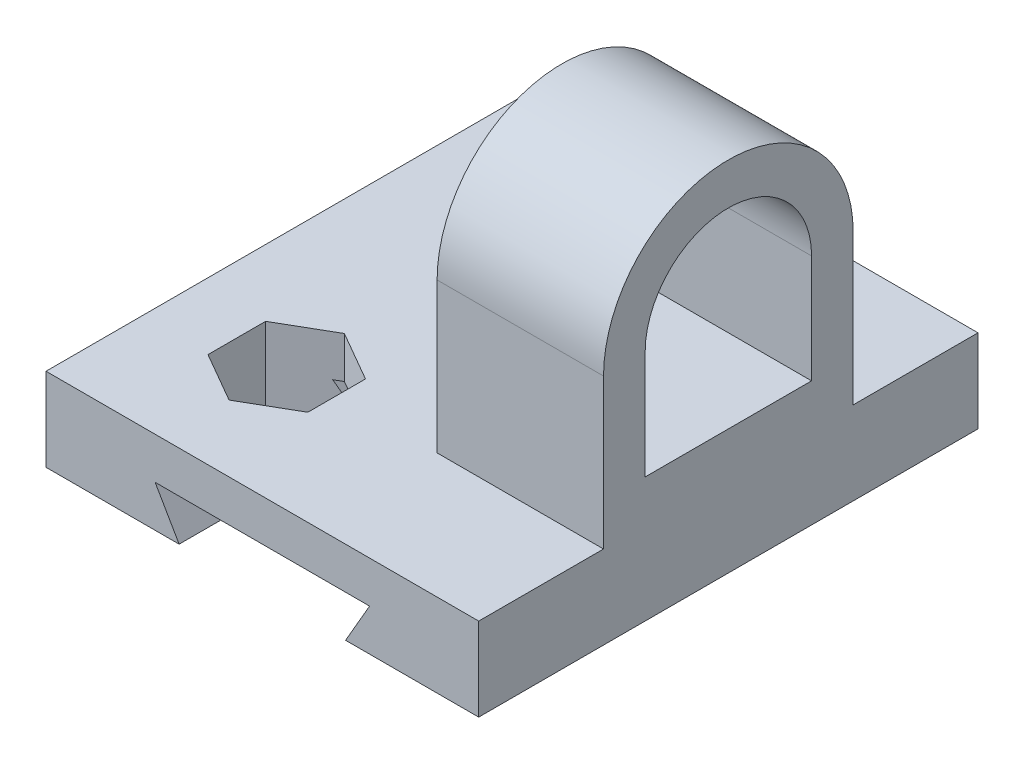
ISO-10303-21;
HEADER;
FILE_DESCRIPTION(('STEP AP214'),'2;1');
FILE_NAME('part.step','',(''),(''),'','','');
FILE_SCHEMA(('AUTOMOTIVE_DESIGN { 1 0 10303 214 1 1 1 1 }'));
ENDSEC;
DATA;
#1=APPLICATION_CONTEXT('core data for automotive mechanical design processes');
#2=APPLICATION_PROTOCOL_DEFINITION('international standard','automotive_design',2000,#1);
#3=PRODUCT_CONTEXT('',#1,'mechanical');
#4=PRODUCT('Part','Part','',(#3));
#5=PRODUCT_RELATED_PRODUCT_CATEGORY('part','',(#4));
#6=PRODUCT_DEFINITION_FORMATION('','',#4);
#7=PRODUCT_DEFINITION_CONTEXT('part definition',#1,'design');
#8=PRODUCT_DEFINITION('design','',#6,#7);
#9=PRODUCT_DEFINITION_SHAPE('','',#8);
#10=(LENGTH_UNIT() NAMED_UNIT(*) SI_UNIT(.MILLI.,.METRE.));
#11=(NAMED_UNIT(*) PLANE_ANGLE_UNIT() SI_UNIT($,.RADIAN.));
#12=(NAMED_UNIT(*) SI_UNIT($,.STERADIAN.) SOLID_ANGLE_UNIT());
#13=UNCERTAINTY_MEASURE_WITH_UNIT(LENGTH_MEASURE(1.E-05),#10,'distance_accuracy_value','');
#14=(GEOMETRIC_REPRESENTATION_CONTEXT(3) GLOBAL_UNCERTAINTY_ASSIGNED_CONTEXT((#13)) GLOBAL_UNIT_ASSIGNED_CONTEXT((#10,
#11,#12)) REPRESENTATION_CONTEXT('',''));
#15=CARTESIAN_POINT('',(0.,0.,0.));
#16=DIRECTION('',(0.,0.,1.));
#17=DIRECTION('',(1.,0.,0.));
#18=AXIS2_PLACEMENT_3D('',#15,#16,#17);
#19=CARTESIAN_POINT('',(-12.8867513459481,0.,30.));
#20=DIRECTION('',(-0.866025403784438,-0.500000000000001,0.));
#21=DIRECTION('',(0.500000000000001,-0.866025403784438,0.));
#22=AXIS2_PLACEMENT_3D('',#19,#20,#21);
#23=PLANE('',#22);
#24=DIRECTION('',(0.,0.,-1.));
#25=VECTOR('',#24,1.);
#26=CARTESIAN_POINT('',(-9.99999999999999,-5.,30.));
#27=LINE('',#26,#25);
#28=CARTESIAN_POINT('',(-9.99999999999999,-5.,30.));
#29=VERTEX_POINT('',#28);
#30=CARTESIAN_POINT('',(-9.99999999999999,-5.,20.8452994616207));
#31=VERTEX_POINT('',#30);
#32=EDGE_CURVE('E67',#29,#31,#27,.T.);
#33=ORIENTED_EDGE('',*,*,#32,.T.);
#34=DIRECTION('',(0.480384461415262,-0.832050294337843,-0.277350098112615));
#35=VECTOR('',#34,1.);
#36=CARTESIAN_POINT('',(-10.6149849113521,-3.93481488764993,21.2003611657374));
#37=LINE('',#36,#35);
#38=CARTESIAN_POINT('',(-12.,-1.53589838486227,22.));
#39=VERTEX_POINT('',#38);
#40=EDGE_CURVE('E265',#39,#31,#37,.T.);
#41=ORIENTED_EDGE('',*,*,#40,.F.);
#42=DIRECTION('',(0.480384461415262,-0.832050294337843,0.277350098112615));
#43=VECTOR('',#42,1.);
#44=CARTESIAN_POINT('',(-12.4611387575059,-0.737182627522773,21.7337614142202));
#45=LINE('',#44,#43);
#46=CARTESIAN_POINT('',(-12.8867513459481,0.,21.4880338717126));
#47=VERTEX_POINT('',#46);
#48=EDGE_CURVE('E262',#47,#39,#45,.T.);
#49=ORIENTED_EDGE('',*,*,#48,.F.);
#50=DIRECTION('',(0.,0.,-1.));
#51=VECTOR('',#50,1.);
#52=CARTESIAN_POINT('',(-12.8867513459481,0.,30.));
#53=LINE('',#52,#51);
#54=CARTESIAN_POINT('',(-12.8867513459481,0.,30.));
#55=VERTEX_POINT('',#54);
#56=EDGE_CURVE('E419',#55,#47,#53,.T.);
#57=ORIENTED_EDGE('',*,*,#56,.F.);
#58=DIRECTION('',(-0.500000000000001,0.866025403784438,0.));
#59=VECTOR('',#58,1.);
#60=CARTESIAN_POINT('',(-12.8867513459481,0.,30.));
#61=LINE('',#60,#59);
#62=EDGE_CURVE('E372',#29,#55,#61,.T.);
#63=ORIENTED_EDGE('',*,*,#62,.F.);
#64=EDGE_LOOP('',(#33,#41,#49,#57,#63));
#65=FACE_BOUND('',#64,.T.);
#66=ADVANCED_FACE('F59',(#65),#23,.F.);
#67=CARTESIAN_POINT('',(-26.,5.,30.));
#68=DIRECTION('',(0.,-1.,0.));
#69=DIRECTION('',(1.,0.,0.));
#70=AXIS2_PLACEMENT_3D('',#67,#68,#69);
#71=PLANE('',#70);
#72=DIRECTION('',(-0.866025403784438,0.,-0.5));
#73=VECTOR('',#72,1.);
#74=CARTESIAN_POINT('',(-5.99999999999999,5.,11.6076951545867));
#75=LINE('',#74,#73);
#76=CARTESIAN_POINT('',(-5.99999999999999,5.,11.6076951545867));
#77=VERTEX_POINT('',#76);
#78=CARTESIAN_POINT('',(-12.,5.,8.14359353944899));
#79=VERTEX_POINT('',#78);
#80=EDGE_CURVE('E280',#77,#79,#75,.T.);
#81=ORIENTED_EDGE('',*,*,#80,.F.);
#82=DIRECTION('',(0.,0.,-1.));
#83=VECTOR('',#82,1.);
#84=CARTESIAN_POINT('',(-5.99999999999999,5.,18.5358983848622));
#85=LINE('',#84,#83);
#86=CARTESIAN_POINT('',(-5.99999999999999,5.,18.5358983848622));
#87=VERTEX_POINT('',#86);
#88=EDGE_CURVE('E74',#87,#77,#85,.T.);
#89=ORIENTED_EDGE('',*,*,#88,.F.);
#90=DIRECTION('',(0.866025403784438,0.,-0.5));
#91=VECTOR('',#90,1.);
#92=CARTESIAN_POINT('',(-12.,5.,22.));
#93=LINE('',#92,#91);
#94=CARTESIAN_POINT('',(-12.,5.,22.));
#95=VERTEX_POINT('',#94);
#96=EDGE_CURVE('E240',#95,#87,#93,.T.);
#97=ORIENTED_EDGE('',*,*,#96,.F.);
#98=DIRECTION('',(0.866025403784438,0.,0.5));
#99=VECTOR('',#98,1.);
#100=CARTESIAN_POINT('',(-18.,5.,18.5358983848622));
#101=LINE('',#100,#99);
#102=CARTESIAN_POINT('',(-18.,5.,18.5358983848622));
#103=VERTEX_POINT('',#102);
#104=EDGE_CURVE('E288',#103,#95,#101,.T.);
#105=ORIENTED_EDGE('',*,*,#104,.F.);
#106=DIRECTION('',(0.,0.,1.));
#107=VECTOR('',#106,1.);
#108=CARTESIAN_POINT('',(-18.,5.,11.6076951545867));
#109=LINE('',#108,#107);
#110=CARTESIAN_POINT('',(-18.,5.,11.6076951545867));
#111=VERTEX_POINT('',#110);
#112=EDGE_CURVE('E285',#111,#103,#109,.T.);
#113=ORIENTED_EDGE('',*,*,#112,.F.);
#114=DIRECTION('',(-0.866025403784438,0.,0.5));
#115=VECTOR('',#114,1.);
#116=CARTESIAN_POINT('',(-12.,5.,8.14359353944899));
#117=LINE('',#116,#115);
#118=EDGE_CURVE('E282',#79,#111,#117,.T.);
#119=ORIENTED_EDGE('',*,*,#118,.F.);
#120=EDGE_LOOP('',(#81,#89,#97,#105,#113,#119));
#121=FACE_BOUND('',#120,.T.);
#122=DIRECTION('',(1.,0.,0.));
#123=VECTOR('',#122,1.);
#124=CARTESIAN_POINT('',(6.,4.99999999999998,15.));
#125=LINE('',#124,#123);
#126=CARTESIAN_POINT('',(6.,4.99999999999998,15.));
#127=VERTEX_POINT('',#126);
#128=CARTESIAN_POINT('',(26.,5.,15.));
#129=VERTEX_POINT('',#128);
#130=EDGE_CURVE('E357',#127,#129,#125,.T.);
#131=ORIENTED_EDGE('',*,*,#130,.F.);
#132=DIRECTION('',(0.,0.,1.));
#133=VECTOR('',#132,1.);
#134=CARTESIAN_POINT('',(6.,4.99999999999998,0.));
#135=LINE('',#134,#133);
#136=CARTESIAN_POINT('',(6.,4.99999999999998,-15.));
#137=VERTEX_POINT('',#136);
#138=EDGE_CURVE('E345',#137,#127,#135,.T.);
#139=ORIENTED_EDGE('',*,*,#138,.F.);
#140=DIRECTION('',(1.,0.,0.));
#141=VECTOR('',#140,1.);
#142=CARTESIAN_POINT('',(6.,4.99999999999998,-15.));
#143=LINE('',#142,#141);
#144=CARTESIAN_POINT('',(26.,5.,-15.));
#145=VERTEX_POINT('',#144);
#146=EDGE_CURVE('E359',#137,#145,#143,.T.);
#147=ORIENTED_EDGE('',*,*,#146,.T.);
#148=DIRECTION('',(0.,0.,-1.));
#149=VECTOR('',#148,1.);
#150=CARTESIAN_POINT('',(26.,5.,30.));
#151=LINE('',#150,#149);
#152=CARTESIAN_POINT('',(26.,5.,-30.));
#153=VERTEX_POINT('',#152);
#154=EDGE_CURVE('E405',#145,#153,#151,.T.);
#155=ORIENTED_EDGE('',*,*,#154,.T.);
#156=DIRECTION('',(-1.,0.,0.));
#157=VECTOR('',#156,1.);
#158=CARTESIAN_POINT('',(-26.,5.,-30.));
#159=LINE('',#158,#157);
#160=CARTESIAN_POINT('',(-26.,5.,-30.));
#161=VERTEX_POINT('',#160);
#162=EDGE_CURVE('E370',#153,#161,#159,.T.);
#163=ORIENTED_EDGE('',*,*,#162,.T.);
#164=DIRECTION('',(0.,0.,-1.));
#165=VECTOR('',#164,1.);
#166=CARTESIAN_POINT('',(-26.,5.,30.));
#167=LINE('',#166,#165);
#168=CARTESIAN_POINT('',(-26.,5.,30.));
#169=VERTEX_POINT('',#168);
#170=EDGE_CURVE('E384',#169,#161,#167,.T.);
#171=ORIENTED_EDGE('',*,*,#170,.F.);
#172=DIRECTION('',(-1.,0.,0.));
#173=VECTOR('',#172,1.);
#174=CARTESIAN_POINT('',(-26.,5.,30.));
#175=LINE('',#174,#173);
#176=CARTESIAN_POINT('',(26.,5.,30.));
#177=VERTEX_POINT('',#176);
#178=EDGE_CURVE('E382',#177,#169,#175,.T.);
#179=ORIENTED_EDGE('',*,*,#178,.F.);
#180=EDGE_CURVE('E406',#177,#129,#151,.T.);
#181=ORIENTED_EDGE('',*,*,#180,.T.);
#182=EDGE_LOOP('',(#131,#139,#147,#155,#163,#171,#179,#181));
#183=FACE_BOUND('',#182,.T.);
#184=ADVANCED_FACE('F463',(#121,#183),#71,.F.);
#185=CARTESIAN_POINT('',(-26.,-5.00000000000001,30.));
#186=DIRECTION('',(1.,0.,0.));
#187=DIRECTION('',(0.,0.,-1.));
#188=AXIS2_PLACEMENT_3D('',#185,#186,#187);
#189=PLANE('',#188);
#190=DIRECTION('',(0.,-1.,0.));
#191=VECTOR('',#190,1.);
#192=CARTESIAN_POINT('',(-26.,-5.00000000000001,-30.));
#193=LINE('',#192,#191);
#194=CARTESIAN_POINT('',(-26.,-5.00000000000001,-30.));
#195=VERTEX_POINT('',#194);
#196=EDGE_CURVE('E365',#161,#195,#193,.T.);
#197=ORIENTED_EDGE('',*,*,#196,.T.);
#198=DIRECTION('',(0.,0.,-1.));
#199=VECTOR('',#198,1.);
#200=CARTESIAN_POINT('',(-26.,-5.00000000000001,30.));
#201=LINE('',#200,#199);
#202=CARTESIAN_POINT('',(-26.,-5.00000000000001,30.));
#203=VERTEX_POINT('',#202);
#204=EDGE_CURVE('E12',#203,#195,#201,.T.);
#205=ORIENTED_EDGE('',*,*,#204,.F.);
#206=DIRECTION('',(0.,-1.,0.));
#207=VECTOR('',#206,1.);
#208=CARTESIAN_POINT('',(-26.,-5.00000000000001,30.));
#209=LINE('',#208,#207);
#210=EDGE_CURVE('E366',#169,#203,#209,.T.);
#211=ORIENTED_EDGE('',*,*,#210,.F.);
#212=ORIENTED_EDGE('',*,*,#170,.T.);
#213=EDGE_LOOP('',(#197,#205,#211,#212));
#214=FACE_BOUND('',#213,.T.);
#215=ADVANCED_FACE('F61',(#214),#189,.F.);
#216=CARTESIAN_POINT('',(-9.99999999999999,-5.,30.));
#217=DIRECTION('',(0.,1.,0.));
#218=DIRECTION('',(-1.,0.,0.));
#219=AXIS2_PLACEMENT_3D('',#216,#217,#218);
#220=PLANE('',#219);
#221=DIRECTION('',(-0.866025403784439,0.,-0.5));
#222=VECTOR('',#221,1.);
#223=CARTESIAN_POINT('',(-18.,-5.00000000000001,18.5358983848622));
#224=LINE('',#223,#222);
#225=CARTESIAN_POINT('',(-12.,-5.00000000000001,22.));
#226=VERTEX_POINT('',#225);
#227=CARTESIAN_POINT('',(-18.,-5.00000000000001,18.5358983848622));
#228=VERTEX_POINT('',#227);
#229=EDGE_CURVE('E273',#226,#228,#224,.T.);
#230=ORIENTED_EDGE('',*,*,#229,.F.);
#231=DIRECTION('',(-0.866025403784439,0.,0.5));
#232=VECTOR('',#231,1.);
#233=CARTESIAN_POINT('',(-12.,-5.,22.));
#234=LINE('',#233,#232);
#235=EDGE_CURVE('E276',#31,#226,#234,.T.);
#236=ORIENTED_EDGE('',*,*,#235,.F.);
#237=ORIENTED_EDGE('',*,*,#32,.F.);
#238=DIRECTION('',(1.,0.,0.));
#239=VECTOR('',#238,1.);
#240=CARTESIAN_POINT('',(-9.99999999999999,-5.,30.));
#241=LINE('',#240,#239);
#242=EDGE_CURVE('E369',#203,#29,#241,.T.);
#243=ORIENTED_EDGE('',*,*,#242,.F.);
#244=ORIENTED_EDGE('',*,*,#204,.T.);
#245=DIRECTION('',(1.,0.,0.));
#246=VECTOR('',#245,1.);
#247=CARTESIAN_POINT('',(-9.99999999999999,-5.,-30.));
#248=LINE('',#247,#246);
#249=CARTESIAN_POINT('',(-9.99999999999999,-5.,-30.));
#250=VERTEX_POINT('',#249);
#251=EDGE_CURVE('E387',#195,#250,#248,.T.);
#252=ORIENTED_EDGE('',*,*,#251,.T.);
#253=CARTESIAN_POINT('',(-9.99999999999999,-5.,9.29829407782823));
#254=VERTEX_POINT('',#253);
#255=EDGE_CURVE('E420',#254,#250,#27,.T.);
#256=ORIENTED_EDGE('',*,*,#255,.F.);
#257=DIRECTION('',(0.866025403784439,0.,0.5));
#258=VECTOR('',#257,1.);
#259=CARTESIAN_POINT('',(-5.99999999999999,-5.,11.6076951545867));
#260=LINE('',#259,#258);
#261=CARTESIAN_POINT('',(-12.,-5.,8.14359353944899));
#262=VERTEX_POINT('',#261);
#263=EDGE_CURVE('E305',#262,#254,#260,.T.);
#264=ORIENTED_EDGE('',*,*,#263,.F.);
#265=DIRECTION('',(0.866025403784439,0.,-0.5));
#266=VECTOR('',#265,1.);
#267=CARTESIAN_POINT('',(-12.,-5.,8.14359353944899));
#268=LINE('',#267,#266);
#269=CARTESIAN_POINT('',(-18.,-5.,11.6076951545867));
#270=VERTEX_POINT('',#269);
#271=EDGE_CURVE('E267',#270,#262,#268,.T.);
#272=ORIENTED_EDGE('',*,*,#271,.F.);
#273=DIRECTION('',(0.,0.,-1.));
#274=VECTOR('',#273,1.);
#275=CARTESIAN_POINT('',(-18.,-5.00000000000001,11.6076951545867));
#276=LINE('',#275,#274);
#277=EDGE_CURVE('E270',#228,#270,#276,.T.);
#278=ORIENTED_EDGE('',*,*,#277,.F.);
#279=EDGE_LOOP('',(#230,#236,#237,#243,#244,#252,#256,#264,#272,#278));
#280=FACE_BOUND('',#279,.T.);
#281=ADVANCED_FACE('F437',(#280),#220,.F.);
#282=CARTESIAN_POINT('',(-12.8867513459481,0.,8.65555966773641));
#283=VERTEX_POINT('',#282);
#284=CARTESIAN_POINT('',(-12.8867513459481,0.,-30.));
#285=VERTEX_POINT('',#284);
#286=EDGE_CURVE('E418',#283,#285,#53,.T.);
#287=ORIENTED_EDGE('',*,*,#286,.F.);
#288=DIRECTION('',(-0.480384461415262,0.832050294337843,0.277350098112615));
#289=VECTOR('',#288,1.);
#290=CARTESIAN_POINT('',(-10.6149849113521,-3.93481488764993,7.34395470518643));
#291=LINE('',#290,#289);
#292=CARTESIAN_POINT('',(-12.,-1.53589838486227,8.14359353944899));
#293=VERTEX_POINT('',#292);
#294=EDGE_CURVE('E260',#293,#283,#291,.T.);
#295=ORIENTED_EDGE('',*,*,#294,.F.);
#296=DIRECTION('',(-0.480384461415262,0.832050294337843,-0.277350098112615));
#297=VECTOR('',#296,1.);
#298=CARTESIAN_POINT('',(-8.76883106519824,-7.13244714777709,10.0091097937539));
#299=LINE('',#298,#297);
#300=EDGE_CURVE('E246',#254,#293,#299,.T.);
#301=ORIENTED_EDGE('',*,*,#300,.F.);
#302=ORIENTED_EDGE('',*,*,#255,.T.);
#303=DIRECTION('',(-0.500000000000001,0.866025403784438,0.));
#304=VECTOR('',#303,1.);
#305=CARTESIAN_POINT('',(-12.8867513459481,0.,-30.));
#306=LINE('',#305,#304);
#307=EDGE_CURVE('E390',#250,#285,#306,.T.);
#308=ORIENTED_EDGE('',*,*,#307,.T.);
#309=EDGE_LOOP('',(#287,#295,#301,#302,#308));
#310=FACE_BOUND('',#309,.T.);
#311=ADVANCED_FACE('F430',(#310),#23,.F.);
#312=CARTESIAN_POINT('',(12.8867513459482,0.,30.));
#313=DIRECTION('',(0.,1.,0.));
#314=DIRECTION('',(-1.,0.,0.));
#315=AXIS2_PLACEMENT_3D('',#312,#313,#314);
#316=PLANE('',#315);
#317=ORIENTED_EDGE('',*,*,#56,.T.);
#318=DIRECTION('',(-0.866025403784439,0.,-0.5));
#319=VECTOR('',#318,1.);
#320=CARTESIAN_POINT('',(-18.,0.,18.5358983848622));
#321=LINE('',#320,#319);
#322=CARTESIAN_POINT('',(-12.,0.,22.));
#323=VERTEX_POINT('',#322);
#324=EDGE_CURVE('E255',#323,#47,#321,.T.);
#325=ORIENTED_EDGE('',*,*,#324,.F.);
#326=DIRECTION('',(-0.866025403784439,0.,0.5));
#327=VECTOR('',#326,1.);
#328=CARTESIAN_POINT('',(-12.,0.,22.));
#329=LINE('',#328,#327);
#330=CARTESIAN_POINT('',(-5.99999999999999,0.,18.5358983848622));
#331=VERTEX_POINT('',#330);
#332=EDGE_CURVE('E253',#331,#323,#329,.T.);
#333=ORIENTED_EDGE('',*,*,#332,.F.);
#334=DIRECTION('',(0.,0.,1.));
#335=VECTOR('',#334,1.);
#336=CARTESIAN_POINT('',(-5.99999999999999,0.,18.5358983848622));
#337=LINE('',#336,#335);
#338=CARTESIAN_POINT('',(-5.99999999999999,0.,11.6076951545867));
#339=VERTEX_POINT('',#338);
#340=EDGE_CURVE('E234',#339,#331,#337,.T.);
#341=ORIENTED_EDGE('',*,*,#340,.F.);
#342=DIRECTION('',(0.866025403784439,0.,0.5));
#343=VECTOR('',#342,1.);
#344=CARTESIAN_POINT('',(-5.99999999999999,0.,11.6076951545867));
#345=LINE('',#344,#343);
#346=CARTESIAN_POINT('',(-12.,0.,8.14359353944899));
#347=VERTEX_POINT('',#346);
#348=EDGE_CURVE('E243',#347,#339,#345,.T.);
#349=ORIENTED_EDGE('',*,*,#348,.F.);
#350=DIRECTION('',(0.866025403784439,0.,-0.5));
#351=VECTOR('',#350,1.);
#352=CARTESIAN_POINT('',(-12.,0.,8.14359353944899));
#353=LINE('',#352,#351);
#354=EDGE_CURVE('E82',#283,#347,#353,.T.);
#355=ORIENTED_EDGE('',*,*,#354,.F.);
#356=ORIENTED_EDGE('',*,*,#286,.T.);
#357=DIRECTION('',(1.,0.,0.));
#358=VECTOR('',#357,1.);
#359=CARTESIAN_POINT('',(12.8867513459482,0.,-30.));
#360=LINE('',#359,#358);
#361=CARTESIAN_POINT('',(12.8867513459482,0.,-30.));
#362=VERTEX_POINT('',#361);
#363=EDGE_CURVE('E393',#285,#362,#360,.T.);
#364=ORIENTED_EDGE('',*,*,#363,.T.);
#365=DIRECTION('',(0.,0.,-1.));
#366=VECTOR('',#365,1.);
#367=CARTESIAN_POINT('',(12.8867513459482,0.,30.));
#368=LINE('',#367,#366);
#369=CARTESIAN_POINT('',(12.8867513459482,0.,30.));
#370=VERTEX_POINT('',#369);
#371=EDGE_CURVE('E415',#370,#362,#368,.T.);
#372=ORIENTED_EDGE('',*,*,#371,.F.);
#373=DIRECTION('',(1.,0.,0.));
#374=VECTOR('',#373,1.);
#375=CARTESIAN_POINT('',(12.8867513459482,0.,30.));
#376=LINE('',#375,#374);
#377=EDGE_CURVE('E374',#55,#370,#376,.T.);
#378=ORIENTED_EDGE('',*,*,#377,.F.);
#379=EDGE_LOOP('',(#317,#325,#333,#341,#349,#355,#356,#364,#372,#378));
#380=FACE_BOUND('',#379,.T.);
#381=ADVANCED_FACE('F250',(#380),#316,.F.);
#382=CARTESIAN_POINT('',(10.,-5.,30.));
#383=DIRECTION('',(0.866025403784436,-0.500000000000005,0.));
#384=DIRECTION('',(0.500000000000005,0.866025403784436,0.));
#385=AXIS2_PLACEMENT_3D('',#382,#383,#384);
#386=PLANE('',#385);
#387=DIRECTION('',(-0.500000000000005,-0.866025403784436,0.));
#388=VECTOR('',#387,1.);
#389=CARTESIAN_POINT('',(10.,-5.,-30.));
#390=LINE('',#389,#388);
#391=CARTESIAN_POINT('',(10.,-5.,-30.));
#392=VERTEX_POINT('',#391);
#393=EDGE_CURVE('E395',#362,#392,#390,.T.);
#394=ORIENTED_EDGE('',*,*,#393,.T.);
#395=DIRECTION('',(0.,0.,-1.));
#396=VECTOR('',#395,1.);
#397=CARTESIAN_POINT('',(10.,-5.,30.));
#398=LINE('',#397,#396);
#399=CARTESIAN_POINT('',(10.,-5.,30.));
#400=VERTEX_POINT('',#399);
#401=EDGE_CURVE('E412',#400,#392,#398,.T.);
#402=ORIENTED_EDGE('',*,*,#401,.F.);
#403=DIRECTION('',(-0.500000000000005,-0.866025403784436,0.));
#404=VECTOR('',#403,1.);
#405=CARTESIAN_POINT('',(10.,-5.,30.));
#406=LINE('',#405,#404);
#407=EDGE_CURVE('E376',#370,#400,#406,.T.);
#408=ORIENTED_EDGE('',*,*,#407,.F.);
#409=ORIENTED_EDGE('',*,*,#371,.T.);
#410=EDGE_LOOP('',(#394,#402,#408,#409));
#411=FACE_BOUND('',#410,.T.);
#412=ADVANCED_FACE('F448',(#411),#386,.F.);
#413=CARTESIAN_POINT('',(26.,-5.,30.));
#414=DIRECTION('',(0.,1.,0.));
#415=DIRECTION('',(-1.,0.,0.));
#416=AXIS2_PLACEMENT_3D('',#413,#414,#415);
#417=PLANE('',#416);
#418=DIRECTION('',(1.,0.,0.));
#419=VECTOR('',#418,1.);
#420=CARTESIAN_POINT('',(26.,-5.,-30.));
#421=LINE('',#420,#419);
#422=CARTESIAN_POINT('',(26.,-5.,-30.));
#423=VERTEX_POINT('',#422);
#424=EDGE_CURVE('E397',#392,#423,#421,.T.);
#425=ORIENTED_EDGE('',*,*,#424,.T.);
#426=DIRECTION('',(0.,0.,-1.));
#427=VECTOR('',#426,1.);
#428=CARTESIAN_POINT('',(26.,-5.,30.));
#429=LINE('',#428,#427);
#430=CARTESIAN_POINT('',(26.,-5.,30.));
#431=VERTEX_POINT('',#430);
#432=EDGE_CURVE('E409',#431,#423,#429,.T.);
#433=ORIENTED_EDGE('',*,*,#432,.F.);
#434=DIRECTION('',(1.,0.,0.));
#435=VECTOR('',#434,1.);
#436=CARTESIAN_POINT('',(26.,-5.,30.));
#437=LINE('',#436,#435);
#438=EDGE_CURVE('E378',#400,#431,#437,.T.);
#439=ORIENTED_EDGE('',*,*,#438,.F.);
#440=ORIENTED_EDGE('',*,*,#401,.T.);
#441=EDGE_LOOP('',(#425,#433,#439,#440));
#442=FACE_BOUND('',#441,.T.);
#443=ADVANCED_FACE('F517',(#442),#417,.F.);
#444=CARTESIAN_POINT('',(26.,5.,30.));
#445=DIRECTION('',(-1.,0.,0.));
#446=DIRECTION('',(0.,-1.,0.));
#447=AXIS2_PLACEMENT_3D('',#444,#445,#446);
#448=PLANE('',#447);
#449=DIRECTION('',(0.,1.,0.));
#450=VECTOR('',#449,1.);
#451=CARTESIAN_POINT('',(26.,5.,-30.));
#452=LINE('',#451,#450);
#453=EDGE_CURVE('E399',#423,#153,#452,.T.);
#454=ORIENTED_EDGE('',*,*,#453,.T.);
#455=ORIENTED_EDGE('',*,*,#154,.F.);
#456=DIRECTION('',(0.,-1.,0.));
#457=VECTOR('',#456,1.);
#458=CARTESIAN_POINT('',(26.,0.,-15.));
#459=LINE('',#458,#457);
#460=CARTESIAN_POINT('',(26.,23.,-15.));
#461=VERTEX_POINT('',#460);
#462=EDGE_CURVE('E352',#461,#145,#459,.T.);
#463=ORIENTED_EDGE('',*,*,#462,.F.);
#464=CARTESIAN_POINT('',(26.,23.,0.));
#465=DIRECTION('',(1.,0.,0.));
#466=DIRECTION('',(0.,1.,0.));
#467=AXIS2_PLACEMENT_3D('',#464,#465,#466);
#468=CIRCLE('',#467,15.);
#469=CARTESIAN_POINT('',(26.,23.,15.));
#470=VERTEX_POINT('',#469);
#471=EDGE_CURVE('E338',#470,#461,#468,.F.);
#472=ORIENTED_EDGE('',*,*,#471,.F.);
#473=DIRECTION('',(0.,1.,0.));
#474=VECTOR('',#473,1.);
#475=CARTESIAN_POINT('',(26.,0.,15.));
#476=LINE('',#475,#474);
#477=EDGE_CURVE('E343',#129,#470,#476,.T.);
#478=ORIENTED_EDGE('',*,*,#477,.F.);
#479=ORIENTED_EDGE('',*,*,#180,.F.);
#480=DIRECTION('',(0.,1.,0.));
#481=VECTOR('',#480,1.);
#482=CARTESIAN_POINT('',(26.,5.,30.));
#483=LINE('',#482,#481);
#484=EDGE_CURVE('E380',#431,#177,#483,.T.);
#485=ORIENTED_EDGE('',*,*,#484,.F.);
#486=ORIENTED_EDGE('',*,*,#432,.T.);
#487=EDGE_LOOP('',(#454,#455,#463,#472,#478,#479,#485,#486));
#488=FACE_BOUND('',#487,.T.);
#489=DIRECTION('',(0.,1.,0.));
#490=VECTOR('',#489,1.);
#491=CARTESIAN_POINT('',(26.,0.,10.));
#492=LINE('',#491,#490);
#493=CARTESIAN_POINT('',(26.,10.,10.));
#494=VERTEX_POINT('',#493);
#495=CARTESIAN_POINT('',(26.,23.,10.));
#496=VERTEX_POINT('',#495);
#497=EDGE_CURVE('E311',#494,#496,#492,.T.);
#498=ORIENTED_EDGE('',*,*,#497,.T.);
#499=CARTESIAN_POINT('',(26.,23.,0.));
#500=DIRECTION('',(1.,0.,0.));
#501=DIRECTION('',(0.,-1.,0.));
#502=AXIS2_PLACEMENT_3D('',#499,#500,#501);
#503=CIRCLE('',#502,10.);
#504=CARTESIAN_POINT('',(26.,23.,-10.));
#505=VERTEX_POINT('',#504);
#506=EDGE_CURVE('E307',#496,#505,#503,.F.);
#507=ORIENTED_EDGE('',*,*,#506,.T.);
#508=DIRECTION('',(0.,-1.,0.));
#509=VECTOR('',#508,1.);
#510=CARTESIAN_POINT('',(26.,0.,-10.));
#511=LINE('',#510,#509);
#512=CARTESIAN_POINT('',(26.,10.,-10.));
#513=VERTEX_POINT('',#512);
#514=EDGE_CURVE('E321',#505,#513,#511,.T.);
#515=ORIENTED_EDGE('',*,*,#514,.T.);
#516=DIRECTION('',(0.,0.,1.));
#517=VECTOR('',#516,1.);
#518=CARTESIAN_POINT('',(26.,10.,0.));
#519=LINE('',#518,#517);
#520=EDGE_CURVE('E324',#513,#494,#519,.T.);
#521=ORIENTED_EDGE('',*,*,#520,.T.);
#522=EDGE_LOOP('',(#498,#507,#515,#521));
#523=FACE_BOUND('',#522,.T.);
#524=ADVANCED_FACE('F512',(#488,#523),#448,.F.);
#525=CARTESIAN_POINT('',(0.,0.,30.));
#526=DIRECTION('',(0.,0.,-1.));
#527=DIRECTION('',(-1.,0.,0.));
#528=AXIS2_PLACEMENT_3D('',#525,#526,#527);
#529=PLANE('',#528);
#530=ORIENTED_EDGE('',*,*,#210,.T.);
#531=ORIENTED_EDGE('',*,*,#242,.T.);
#532=ORIENTED_EDGE('',*,*,#62,.T.);
#533=ORIENTED_EDGE('',*,*,#377,.T.);
#534=ORIENTED_EDGE('',*,*,#407,.T.);
#535=ORIENTED_EDGE('',*,*,#438,.T.);
#536=ORIENTED_EDGE('',*,*,#484,.T.);
#537=ORIENTED_EDGE('',*,*,#178,.T.);
#538=EDGE_LOOP('',(#530,#531,#532,#533,#534,#535,#536,#537));
#539=FACE_BOUND('',#538,.T.);
#540=ADVANCED_FACE('F452',(#539),#529,.F.);
#541=CARTESIAN_POINT('',(0.,0.,-30.));
#542=DIRECTION('',(0.,0.,-1.));
#543=DIRECTION('',(-1.,0.,0.));
#544=AXIS2_PLACEMENT_3D('',#541,#542,#543);
#545=PLANE('',#544);
#546=ORIENTED_EDGE('',*,*,#196,.F.);
#547=ORIENTED_EDGE('',*,*,#162,.F.);
#548=ORIENTED_EDGE('',*,*,#453,.F.);
#549=ORIENTED_EDGE('',*,*,#424,.F.);
#550=ORIENTED_EDGE('',*,*,#393,.F.);
#551=ORIENTED_EDGE('',*,*,#363,.F.);
#552=ORIENTED_EDGE('',*,*,#307,.F.);
#553=ORIENTED_EDGE('',*,*,#251,.F.);
#554=EDGE_LOOP('',(#546,#547,#548,#549,#550,#551,#552,#553));
#555=FACE_BOUND('',#554,.T.);
#556=ADVANCED_FACE('F441',(#555),#545,.T.);
#557=CARTESIAN_POINT('',(5.99999999999998,23.,0.));
#558=DIRECTION('',(1.,0.,0.));
#559=DIRECTION('',(0.,1.,0.));
#560=AXIS2_PLACEMENT_3D('',#557,#558,#559);
#561=PLANE('',#560);
#562=CARTESIAN_POINT('',(5.99999999999998,23.,0.));
#563=DIRECTION('',(1.,0.,0.));
#564=DIRECTION('',(0.,1.,0.));
#565=AXIS2_PLACEMENT_3D('',#562,#563,#564);
#566=CIRCLE('',#565,15.);
#567=CARTESIAN_POINT('',(5.99999999999998,23.,15.));
#568=VERTEX_POINT('',#567);
#569=CARTESIAN_POINT('',(5.99999999999998,23.,-15.));
#570=VERTEX_POINT('',#569);
#571=EDGE_CURVE('E339',#568,#570,#566,.F.);
#572=ORIENTED_EDGE('',*,*,#571,.T.);
#573=DIRECTION('',(0.,-1.,0.));
#574=VECTOR('',#573,1.);
#575=CARTESIAN_POINT('',(6.00000000000001,0.,-15.));
#576=LINE('',#575,#574);
#577=EDGE_CURVE('E342',#570,#137,#576,.T.);
#578=ORIENTED_EDGE('',*,*,#577,.T.);
#579=ORIENTED_EDGE('',*,*,#138,.T.);
#580=DIRECTION('',(0.,1.,0.));
#581=VECTOR('',#580,1.);
#582=CARTESIAN_POINT('',(6.00000000000001,0.,15.));
#583=LINE('',#582,#581);
#584=EDGE_CURVE('E347',#127,#568,#583,.T.);
#585=ORIENTED_EDGE('',*,*,#584,.T.);
#586=EDGE_LOOP('',(#572,#578,#579,#585));
#587=FACE_BOUND('',#586,.T.);
#588=CARTESIAN_POINT('',(5.99999999999998,23.,0.));
#589=DIRECTION('',(1.,0.,0.));
#590=DIRECTION('',(0.,-1.,0.));
#591=AXIS2_PLACEMENT_3D('',#588,#589,#590);
#592=CIRCLE('',#591,10.);
#593=CARTESIAN_POINT('',(5.99999999999998,23.,10.));
#594=VERTEX_POINT('',#593);
#595=CARTESIAN_POINT('',(5.99999999999998,23.,-10.));
#596=VERTEX_POINT('',#595);
#597=EDGE_CURVE('E308',#594,#596,#592,.F.);
#598=ORIENTED_EDGE('',*,*,#597,.F.);
#599=DIRECTION('',(0.,1.,0.));
#600=VECTOR('',#599,1.);
#601=CARTESIAN_POINT('',(6.00000000000001,0.,10.));
#602=LINE('',#601,#600);
#603=CARTESIAN_POINT('',(6.,9.99999999999998,10.));
#604=VERTEX_POINT('',#603);
#605=EDGE_CURVE('E316',#604,#594,#602,.T.);
#606=ORIENTED_EDGE('',*,*,#605,.F.);
#607=DIRECTION('',(0.,0.,1.));
#608=VECTOR('',#607,1.);
#609=CARTESIAN_POINT('',(5.99999999999999,9.99999999999998,0.));
#610=LINE('',#609,#608);
#611=CARTESIAN_POINT('',(5.99999999999999,9.99999999999998,-10.));
#612=VERTEX_POINT('',#611);
#613=EDGE_CURVE('E313',#612,#604,#610,.T.);
#614=ORIENTED_EDGE('',*,*,#613,.F.);
#615=DIRECTION('',(0.,-1.,0.));
#616=VECTOR('',#615,1.);
#617=CARTESIAN_POINT('',(6.00000000000001,0.,-10.));
#618=LINE('',#617,#616);
#619=EDGE_CURVE('E310',#596,#612,#618,.T.);
#620=ORIENTED_EDGE('',*,*,#619,.F.);
#621=EDGE_LOOP('',(#598,#606,#614,#620));
#622=FACE_BOUND('',#621,.T.);
#623=ADVANCED_FACE('F529',(#587,#622),#561,.F.);
#624=CARTESIAN_POINT('',(5.99999999999998,23.,0.));
#625=DIRECTION('',(1.,0.,0.));
#626=DIRECTION('',(0.,1.,0.));
#627=AXIS2_PLACEMENT_3D('',#624,#625,#626);
#628=CYLINDRICAL_SURFACE('',#627,15.);
#629=ORIENTED_EDGE('',*,*,#471,.T.);
#630=DIRECTION('',(1.,0.,0.));
#631=VECTOR('',#630,1.);
#632=CARTESIAN_POINT('',(5.99999999999998,23.,-15.));
#633=LINE('',#632,#631);
#634=EDGE_CURVE('E362',#570,#461,#633,.T.);
#635=ORIENTED_EDGE('',*,*,#634,.F.);
#636=ORIENTED_EDGE('',*,*,#571,.F.);
#637=DIRECTION('',(1.,0.,0.));
#638=VECTOR('',#637,1.);
#639=CARTESIAN_POINT('',(5.99999999999998,23.,15.));
#640=LINE('',#639,#638);
#641=EDGE_CURVE('E349',#568,#470,#640,.T.);
#642=ORIENTED_EDGE('',*,*,#641,.T.);
#643=EDGE_LOOP('',(#629,#635,#636,#642));
#644=FACE_BOUND('',#643,.T.);
#645=ADVANCED_FACE('F532',(#644),#628,.T.);
#646=CARTESIAN_POINT('',(6.00000000000001,0.,-15.));
#647=DIRECTION('',(0.,0.,1.));
#648=DIRECTION('',(0.,-1.,0.));
#649=AXIS2_PLACEMENT_3D('',#646,#647,#648);
#650=PLANE('',#649);
#651=ORIENTED_EDGE('',*,*,#462,.T.);
#652=ORIENTED_EDGE('',*,*,#146,.F.);
#653=ORIENTED_EDGE('',*,*,#577,.F.);
#654=ORIENTED_EDGE('',*,*,#634,.T.);
#655=EDGE_LOOP('',(#651,#652,#653,#654));
#656=FACE_BOUND('',#655,.T.);
#657=ADVANCED_FACE('F535',(#656),#650,.F.);
#658=CARTESIAN_POINT('',(6.00000000000001,0.,15.));
#659=DIRECTION('',(0.,0.,-1.));
#660=DIRECTION('',(0.,1.,0.));
#661=AXIS2_PLACEMENT_3D('',#658,#659,#660);
#662=PLANE('',#661);
#663=ORIENTED_EDGE('',*,*,#477,.T.);
#664=ORIENTED_EDGE('',*,*,#641,.F.);
#665=ORIENTED_EDGE('',*,*,#584,.F.);
#666=ORIENTED_EDGE('',*,*,#130,.T.);
#667=EDGE_LOOP('',(#663,#664,#665,#666));
#668=FACE_BOUND('',#667,.T.);
#669=ADVANCED_FACE('F539',(#668),#662,.F.);
#670=CARTESIAN_POINT('',(5.99999999999998,23.,0.));
#671=DIRECTION('',(1.,0.,0.));
#672=DIRECTION('',(0.,1.,0.));
#673=AXIS2_PLACEMENT_3D('',#670,#671,#672);
#674=CYLINDRICAL_SURFACE('',#673,10.);
#675=ORIENTED_EDGE('',*,*,#506,.F.);
#676=DIRECTION('',(1.,0.,0.));
#677=VECTOR('',#676,1.);
#678=CARTESIAN_POINT('',(5.99999999999998,23.,10.));
#679=LINE('',#678,#677);
#680=EDGE_CURVE('E318',#594,#496,#679,.T.);
#681=ORIENTED_EDGE('',*,*,#680,.F.);
#682=ORIENTED_EDGE('',*,*,#597,.T.);
#683=DIRECTION('',(1.,0.,0.));
#684=VECTOR('',#683,1.);
#685=CARTESIAN_POINT('',(5.99999999999998,23.,-10.));
#686=LINE('',#685,#684);
#687=EDGE_CURVE('E335',#596,#505,#686,.T.);
#688=ORIENTED_EDGE('',*,*,#687,.T.);
#689=EDGE_LOOP('',(#675,#681,#682,#688));
#690=FACE_BOUND('',#689,.T.);
#691=ADVANCED_FACE('F543',(#690),#674,.F.);
#692=CARTESIAN_POINT('',(6.00000000000001,0.,-10.));
#693=DIRECTION('',(0.,0.,1.));
#694=DIRECTION('',(0.,-1.,0.));
#695=AXIS2_PLACEMENT_3D('',#692,#693,#694);
#696=PLANE('',#695);
#697=ORIENTED_EDGE('',*,*,#514,.F.);
#698=ORIENTED_EDGE('',*,*,#687,.F.);
#699=ORIENTED_EDGE('',*,*,#619,.T.);
#700=DIRECTION('',(1.,0.,0.));
#701=VECTOR('',#700,1.);
#702=CARTESIAN_POINT('',(5.99999999999999,9.99999999999998,-10.));
#703=LINE('',#702,#701);
#704=EDGE_CURVE('E333',#612,#513,#703,.T.);
#705=ORIENTED_EDGE('',*,*,#704,.T.);
#706=EDGE_LOOP('',(#697,#698,#699,#705));
#707=FACE_BOUND('',#706,.T.);
#708=ADVANCED_FACE('F550',(#707),#696,.T.);
#709=CARTESIAN_POINT('',(5.99999999999999,9.99999999999998,0.));
#710=DIRECTION('',(0.,1.,0.));
#711=DIRECTION('',(-1.,0.,0.));
#712=AXIS2_PLACEMENT_3D('',#709,#710,#711);
#713=PLANE('',#712);
#714=ORIENTED_EDGE('',*,*,#520,.F.);
#715=ORIENTED_EDGE('',*,*,#704,.F.);
#716=ORIENTED_EDGE('',*,*,#613,.T.);
#717=DIRECTION('',(1.,0.,0.));
#718=VECTOR('',#717,1.);
#719=CARTESIAN_POINT('',(5.99999999999999,9.99999999999998,10.));
#720=LINE('',#719,#718);
#721=EDGE_CURVE('E331',#604,#494,#720,.T.);
#722=ORIENTED_EDGE('',*,*,#721,.T.);
#723=EDGE_LOOP('',(#714,#715,#716,#722));
#724=FACE_BOUND('',#723,.T.);
#725=ADVANCED_FACE('F554',(#724),#713,.T.);
#726=CARTESIAN_POINT('',(6.00000000000001,0.,10.));
#727=DIRECTION('',(0.,0.,-1.));
#728=DIRECTION('',(0.,1.,0.));
#729=AXIS2_PLACEMENT_3D('',#726,#727,#728);
#730=PLANE('',#729);
#731=ORIENTED_EDGE('',*,*,#497,.F.);
#732=ORIENTED_EDGE('',*,*,#721,.F.);
#733=ORIENTED_EDGE('',*,*,#605,.T.);
#734=ORIENTED_EDGE('',*,*,#680,.T.);
#735=EDGE_LOOP('',(#731,#732,#733,#734));
#736=FACE_BOUND('',#735,.T.);
#737=ADVANCED_FACE('F558',(#736),#730,.T.);
#738=CARTESIAN_POINT('',(-5.99999999999999,-5.00100000000001,18.5358983848622));
#739=DIRECTION('',(1.,0.,0.));
#740=DIRECTION('',(0.,0.,-1.));
#741=AXIS2_PLACEMENT_3D('',#738,#739,#740);
#742=PLANE('',#741);
#743=ORIENTED_EDGE('',*,*,#340,.T.);
#744=DIRECTION('',(0.,1.,0.));
#745=VECTOR('',#744,1.);
#746=CARTESIAN_POINT('',(-5.99999999999999,-5.00100000000001,18.5358983848622));
#747=LINE('',#746,#745);
#748=EDGE_CURVE('E247',#331,#87,#747,.T.);
#749=ORIENTED_EDGE('',*,*,#748,.T.);
#750=ORIENTED_EDGE('',*,*,#88,.T.);
#751=DIRECTION('',(0.,1.,0.));
#752=VECTOR('',#751,1.);
#753=CARTESIAN_POINT('',(-5.99999999999999,-5.00100000000001,11.6076951545867));
#754=LINE('',#753,#752);
#755=EDGE_CURVE('E230',#339,#77,#754,.T.);
#756=ORIENTED_EDGE('',*,*,#755,.F.);
#757=EDGE_LOOP('',(#743,#749,#750,#756));
#758=FACE_BOUND('',#757,.T.);
#759=ADVANCED_FACE('F232',(#758),#742,.F.);
#760=CARTESIAN_POINT('',(-12.,-5.00100000000001,22.));
#761=DIRECTION('',(0.5,0.,0.866025403784438));
#762=DIRECTION('',(0.866025403784439,0.,-0.5));
#763=AXIS2_PLACEMENT_3D('',#760,#761,#762);
#764=PLANE('',#763);
#765=ORIENTED_EDGE('',*,*,#235,.T.);
#766=DIRECTION('',(0.,1.,0.));
#767=VECTOR('',#766,1.);
#768=CARTESIAN_POINT('',(-12.,-5.00100000000001,22.));
#769=LINE('',#768,#767);
#770=EDGE_CURVE('E294',#226,#39,#769,.T.);
#771=ORIENTED_EDGE('',*,*,#770,.T.);
#772=ORIENTED_EDGE('',*,*,#40,.T.);
#773=EDGE_LOOP('',(#765,#771,#772));
#774=FACE_BOUND('',#773,.T.);
#775=ADVANCED_FACE('F563',(#774),#764,.F.);
#776=ORIENTED_EDGE('',*,*,#332,.T.);
#777=EDGE_CURVE('E295',#323,#95,#769,.T.);
#778=ORIENTED_EDGE('',*,*,#777,.T.);
#779=ORIENTED_EDGE('',*,*,#96,.T.);
#780=ORIENTED_EDGE('',*,*,#748,.F.);
#781=EDGE_LOOP('',(#776,#778,#779,#780));
#782=FACE_BOUND('',#781,.T.);
#783=ADVANCED_FACE('F461',(#782),#764,.F.);
#784=CARTESIAN_POINT('',(-18.,-5.00100000000001,18.5358983848622));
#785=DIRECTION('',(-0.5,0.,0.866025403784439));
#786=DIRECTION('',(0.866025403784439,0.,0.5));
#787=AXIS2_PLACEMENT_3D('',#784,#785,#786);
#788=PLANE('',#787);
#789=ORIENTED_EDGE('',*,*,#229,.T.);
#790=DIRECTION('',(0.,1.,0.));
#791=VECTOR('',#790,1.);
#792=CARTESIAN_POINT('',(-18.,-5.00100000000001,18.5358983848622));
#793=LINE('',#792,#791);
#794=EDGE_CURVE('E297',#228,#103,#793,.T.);
#795=ORIENTED_EDGE('',*,*,#794,.T.);
#796=ORIENTED_EDGE('',*,*,#104,.T.);
#797=ORIENTED_EDGE('',*,*,#777,.F.);
#798=ORIENTED_EDGE('',*,*,#324,.T.);
#799=ORIENTED_EDGE('',*,*,#48,.T.);
#800=ORIENTED_EDGE('',*,*,#770,.F.);
#801=EDGE_LOOP('',(#789,#795,#796,#797,#798,#799,#800));
#802=FACE_BOUND('',#801,.T.);
#803=ADVANCED_FACE('F457',(#802),#788,.F.);
#804=CARTESIAN_POINT('',(-18.,-5.00100000000001,11.6076951545867));
#805=DIRECTION('',(-1.,0.,0.));
#806=DIRECTION('',(0.,-1.,0.));
#807=AXIS2_PLACEMENT_3D('',#804,#805,#806);
#808=PLANE('',#807);
#809=ORIENTED_EDGE('',*,*,#277,.T.);
#810=DIRECTION('',(0.,1.,0.));
#811=VECTOR('',#810,1.);
#812=CARTESIAN_POINT('',(-18.,-5.00100000000001,11.6076951545867));
#813=LINE('',#812,#811);
#814=EDGE_CURVE('E299',#270,#111,#813,.T.);
#815=ORIENTED_EDGE('',*,*,#814,.T.);
#816=ORIENTED_EDGE('',*,*,#112,.T.);
#817=ORIENTED_EDGE('',*,*,#794,.F.);
#818=EDGE_LOOP('',(#809,#815,#816,#817));
#819=FACE_BOUND('',#818,.T.);
#820=ADVANCED_FACE('F471',(#819),#808,.F.);
#821=CARTESIAN_POINT('',(-12.,-5.00100000000001,8.14359353944899));
#822=DIRECTION('',(-0.5,0.,-0.866025403784439));
#823=DIRECTION('',(-0.866025403784439,0.,0.5));
#824=AXIS2_PLACEMENT_3D('',#821,#822,#823);
#825=PLANE('',#824);
#826=ORIENTED_EDGE('',*,*,#271,.T.);
#827=DIRECTION('',(0.,1.,0.));
#828=VECTOR('',#827,1.);
#829=CARTESIAN_POINT('',(-12.,-5.00100000000001,8.14359353944899));
#830=LINE('',#829,#828);
#831=EDGE_CURVE('E301',#262,#293,#830,.T.);
#832=ORIENTED_EDGE('',*,*,#831,.T.);
#833=ORIENTED_EDGE('',*,*,#294,.T.);
#834=ORIENTED_EDGE('',*,*,#354,.T.);
#835=EDGE_CURVE('E239',#347,#79,#830,.T.);
#836=ORIENTED_EDGE('',*,*,#835,.T.);
#837=ORIENTED_EDGE('',*,*,#118,.T.);
#838=ORIENTED_EDGE('',*,*,#814,.F.);
#839=EDGE_LOOP('',(#826,#832,#833,#834,#836,#837,#838));
#840=FACE_BOUND('',#839,.T.);
#841=ADVANCED_FACE('F467',(#840),#825,.F.);
#842=CARTESIAN_POINT('',(-5.99999999999999,-5.00100000000001,11.6076951545867));
#843=DIRECTION('',(0.5,0.,-0.866025403784439));
#844=DIRECTION('',(-0.866025403784439,0.,-0.5));
#845=AXIS2_PLACEMENT_3D('',#842,#843,#844);
#846=PLANE('',#845);
#847=ORIENTED_EDGE('',*,*,#263,.T.);
#848=ORIENTED_EDGE('',*,*,#300,.T.);
#849=ORIENTED_EDGE('',*,*,#831,.F.);
#850=EDGE_LOOP('',(#847,#848,#849));
#851=FACE_BOUND('',#850,.T.);
#852=ADVANCED_FACE('F473',(#851),#846,.F.);
#853=ORIENTED_EDGE('',*,*,#348,.T.);
#854=ORIENTED_EDGE('',*,*,#755,.T.);
#855=ORIENTED_EDGE('',*,*,#80,.T.);
#856=ORIENTED_EDGE('',*,*,#835,.F.);
#857=EDGE_LOOP('',(#853,#854,#855,#856));
#858=FACE_BOUND('',#857,.T.);
#859=ADVANCED_FACE('F244',(#858),#846,.F.);
#860=CLOSED_SHELL('',(#66,#184,#215,#281,#311,#381,#412,#443,#524,#540,#556,#623,#645,#657,#669,
#691,#708,#725,#737,#759,#775,#783,#803,#820,#841,#852,#859));
#861=MANIFOLD_SOLID_BREP('B2',#860);
#862=ADVANCED_BREP_SHAPE_REPRESENTATION('',(#18,#861),#14);
#863=SHAPE_DEFINITION_REPRESENTATION(#9,#862);
ENDSEC;
END-ISO-10303-21;
